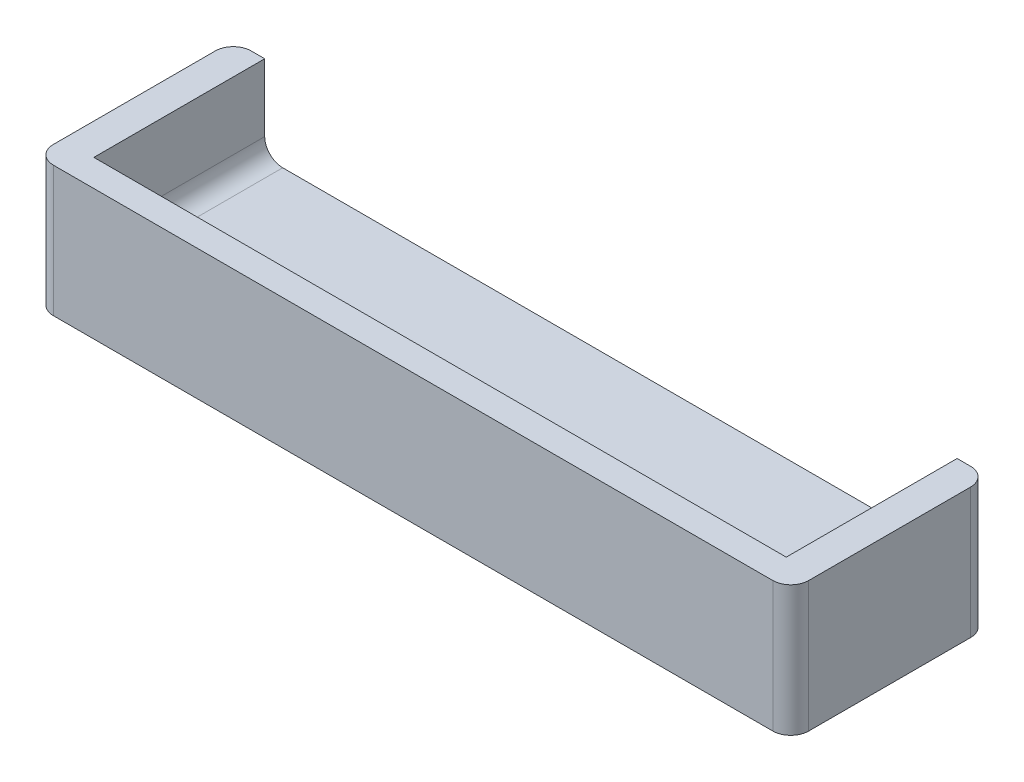
ISO-10303-21;
HEADER;
FILE_DESCRIPTION(('STEP AP214'),'2;1');
FILE_NAME('part.step','',(''),(''),'','','');
FILE_SCHEMA(('AUTOMOTIVE_DESIGN { 1 0 10303 214 1 1 1 1 }'));
ENDSEC;
DATA;
#1=APPLICATION_CONTEXT('core data for automotive mechanical design processes');
#2=APPLICATION_PROTOCOL_DEFINITION('international standard','automotive_design',2000,#1);
#3=PRODUCT_CONTEXT('',#1,'mechanical');
#4=PRODUCT('Part','Part','',(#3));
#5=PRODUCT_RELATED_PRODUCT_CATEGORY('part','',(#4));
#6=PRODUCT_DEFINITION_FORMATION('','',#4);
#7=PRODUCT_DEFINITION_CONTEXT('part definition',#1,'design');
#8=PRODUCT_DEFINITION('design','',#6,#7);
#9=PRODUCT_DEFINITION_SHAPE('','',#8);
#10=(LENGTH_UNIT() NAMED_UNIT(*) SI_UNIT(.MILLI.,.METRE.));
#11=(NAMED_UNIT(*) PLANE_ANGLE_UNIT() SI_UNIT($,.RADIAN.));
#12=(NAMED_UNIT(*) SI_UNIT($,.STERADIAN.) SOLID_ANGLE_UNIT());
#13=UNCERTAINTY_MEASURE_WITH_UNIT(LENGTH_MEASURE(1.E-05),#10,'distance_accuracy_value','');
#14=(GEOMETRIC_REPRESENTATION_CONTEXT(3) GLOBAL_UNCERTAINTY_ASSIGNED_CONTEXT((#13)) GLOBAL_UNIT_ASSIGNED_CONTEXT((#10,
#11,#12)) REPRESENTATION_CONTEXT('',''));
#15=CARTESIAN_POINT('',(0.,0.,0.));
#16=DIRECTION('',(0.,0.,1.));
#17=DIRECTION('',(1.,0.,0.));
#18=AXIS2_PLACEMENT_3D('',#15,#16,#17);
#19=CARTESIAN_POINT('',(42.,7.25000000000001,14.));
#20=DIRECTION('',(-1.,0.,0.));
#21=DIRECTION('',(0.,0.,1.));
#22=AXIS2_PLACEMENT_3D('',#19,#20,#21);
#23=PLANE('',#22);
#24=DIRECTION('',(0.,0.,-1.));
#25=VECTOR('',#24,1.);
#26=CARTESIAN_POINT('',(42.,7.25000000000001,14.));
#27=LINE('',#26,#25);
#28=CARTESIAN_POINT('',(42.,7.25000000000001,15.));
#29=VERTEX_POINT('',#28);
#30=CARTESIAN_POINT('',(42.,7.25000000000001,-3.));
#31=VERTEX_POINT('',#30);
#32=EDGE_CURVE('E195',#29,#31,#27,.T.);
#33=ORIENTED_EDGE('',*,*,#32,.F.);
#34=DIRECTION('',(0.,1.,0.));
#35=VECTOR('',#34,1.);
#36=CARTESIAN_POINT('',(42.,-7.25000000000001,15.));
#37=LINE('',#36,#35);
#38=CARTESIAN_POINT('',(42.,-7.25000000000001,15.));
#39=VERTEX_POINT('',#38);
#40=EDGE_CURVE('E235',#29,#39,#37,.F.);
#41=ORIENTED_EDGE('',*,*,#40,.T.);
#42=DIRECTION('',(0.,0.,-1.));
#43=VECTOR('',#42,1.);
#44=CARTESIAN_POINT('',(42.,-7.25000000000001,14.));
#45=LINE('',#44,#43);
#46=CARTESIAN_POINT('',(42.,-7.25000000000001,-3.));
#47=VERTEX_POINT('',#46);
#48=EDGE_CURVE('E186',#39,#47,#45,.T.);
#49=ORIENTED_EDGE('',*,*,#48,.T.);
#50=DIRECTION('',(0.,-1.,0.));
#51=VECTOR('',#50,1.);
#52=CARTESIAN_POINT('',(42.,7.25000000000001,-3.));
#53=LINE('',#52,#51);
#54=EDGE_CURVE('E56',#47,#31,#53,.F.);
#55=ORIENTED_EDGE('',*,*,#54,.T.);
#56=EDGE_LOOP('',(#33,#41,#49,#55));
#57=FACE_BOUND('',#56,.T.);
#58=ADVANCED_FACE('F33',(#57),#23,.F.);
#59=CARTESIAN_POINT('',(38.5,7.25000000000001,14.));
#60=DIRECTION('',(1.,0.,0.));
#61=DIRECTION('',(0.,0.,-1.));
#62=AXIS2_PLACEMENT_3D('',#59,#60,#61);
#63=PLANE('',#62);
#64=DIRECTION('',(0.,1.,0.));
#65=VECTOR('',#64,1.);
#66=CARTESIAN_POINT('',(38.5,-2.25000000000001,-5.));
#67=LINE('',#66,#65);
#68=CARTESIAN_POINT('',(38.5,-0.25000000000001,-5.));
#69=VERTEX_POINT('',#68);
#70=CARTESIAN_POINT('',(38.5,7.25000000000001,-5.));
#71=VERTEX_POINT('',#70);
#72=EDGE_CURVE('E166',#69,#71,#67,.T.);
#73=ORIENTED_EDGE('',*,*,#72,.F.);
#74=DIRECTION('',(0.,0.,-1.));
#75=VECTOR('',#74,1.);
#76=CARTESIAN_POINT('',(38.5,-0.25000000000001,14.));
#77=LINE('',#76,#75);
#78=CARTESIAN_POINT('',(38.5,-0.25000000000001,14.));
#79=VERTEX_POINT('',#78);
#80=EDGE_CURVE('E202',#69,#79,#77,.F.);
#81=ORIENTED_EDGE('',*,*,#80,.T.);
#82=DIRECTION('',(0.,-1.,0.));
#83=VECTOR('',#82,1.);
#84=CARTESIAN_POINT('',(38.5,7.25000000000001,14.));
#85=LINE('',#84,#83);
#86=CARTESIAN_POINT('',(38.5,7.25000000000001,14.));
#87=VERTEX_POINT('',#86);
#88=EDGE_CURVE('E177',#87,#79,#85,.T.);
#89=ORIENTED_EDGE('',*,*,#88,.F.);
#90=DIRECTION('',(0.,0.,-1.));
#91=VECTOR('',#90,1.);
#92=CARTESIAN_POINT('',(38.5,7.25000000000001,14.));
#93=LINE('',#92,#91);
#94=EDGE_CURVE('E156',#87,#71,#93,.T.);
#95=ORIENTED_EDGE('',*,*,#94,.T.);
#96=EDGE_LOOP('',(#73,#81,#89,#95));
#97=FACE_BOUND('',#96,.T.);
#98=ADVANCED_FACE('F246',(#97),#63,.F.);
#99=CARTESIAN_POINT('',(38.5,-2.25000000000001,14.));
#100=DIRECTION('',(0.,-1.,0.));
#101=DIRECTION('',(0.,0.,-1.));
#102=AXIS2_PLACEMENT_3D('',#99,#100,#101);
#103=PLANE('',#102);
#104=DIRECTION('',(-1.,0.,0.));
#105=VECTOR('',#104,1.);
#106=CARTESIAN_POINT('',(38.5,-2.25000000000001,14.));
#107=LINE('',#106,#105);
#108=CARTESIAN_POINT('',(36.5,-2.25000000000001,14.));
#109=VERTEX_POINT('',#108);
#110=CARTESIAN_POINT('',(-36.5,-2.25000000000001,14.));
#111=VERTEX_POINT('',#110);
#112=EDGE_CURVE('E181',#109,#111,#107,.T.);
#113=ORIENTED_EDGE('',*,*,#112,.F.);
#114=DIRECTION('',(0.,0.,-1.));
#115=VECTOR('',#114,1.);
#116=CARTESIAN_POINT('',(36.5,-2.25000000000001,-5.));
#117=LINE('',#116,#115);
#118=CARTESIAN_POINT('',(36.5,-2.25000000000001,-5.));
#119=VERTEX_POINT('',#118);
#120=EDGE_CURVE('E199',#109,#119,#117,.T.);
#121=ORIENTED_EDGE('',*,*,#120,.T.);
#122=DIRECTION('',(1.,0.,0.));
#123=VECTOR('',#122,1.);
#124=CARTESIAN_POINT('',(-38.5,-2.25000000000001,-5.));
#125=LINE('',#124,#123);
#126=CARTESIAN_POINT('',(-36.5,-2.25000000000001,-5.));
#127=VERTEX_POINT('',#126);
#128=EDGE_CURVE('E163',#127,#119,#125,.T.);
#129=ORIENTED_EDGE('',*,*,#128,.F.);
#130=DIRECTION('',(0.,0.,-1.));
#131=VECTOR('',#130,1.);
#132=CARTESIAN_POINT('',(-36.5,-2.25000000000001,14.));
#133=LINE('',#132,#131);
#134=EDGE_CURVE('E197',#127,#111,#133,.F.);
#135=ORIENTED_EDGE('',*,*,#134,.T.);
#136=EDGE_LOOP('',(#113,#121,#129,#135));
#137=FACE_BOUND('',#136,.T.);
#138=ADVANCED_FACE('F255',(#137),#103,.F.);
#139=CARTESIAN_POINT('',(-38.5,7.25000000000001,14.));
#140=DIRECTION('',(-1.,0.,0.));
#141=DIRECTION('',(0.,0.,1.));
#142=AXIS2_PLACEMENT_3D('',#139,#140,#141);
#143=PLANE('',#142);
#144=DIRECTION('',(0.,1.,0.));
#145=VECTOR('',#144,1.);
#146=CARTESIAN_POINT('',(-38.5,7.25000000000001,14.));
#147=LINE('',#146,#145);
#148=CARTESIAN_POINT('',(-38.5,-0.25000000000001,14.));
#149=VERTEX_POINT('',#148);
#150=CARTESIAN_POINT('',(-38.5,7.25000000000001,14.));
#151=VERTEX_POINT('',#150);
#152=EDGE_CURVE('E184',#149,#151,#147,.T.);
#153=ORIENTED_EDGE('',*,*,#152,.F.);
#154=DIRECTION('',(0.,0.,-1.));
#155=VECTOR('',#154,1.);
#156=CARTESIAN_POINT('',(-38.5,-0.25000000000001,-5.));
#157=LINE('',#156,#155);
#158=CARTESIAN_POINT('',(-38.5,-0.25000000000001,-5.));
#159=VERTEX_POINT('',#158);
#160=EDGE_CURVE('E162',#149,#159,#157,.T.);
#161=ORIENTED_EDGE('',*,*,#160,.T.);
#162=DIRECTION('',(0.,-1.,0.));
#163=VECTOR('',#162,1.);
#164=CARTESIAN_POINT('',(-38.5,7.25000000000001,-5.));
#165=LINE('',#164,#163);
#166=CARTESIAN_POINT('',(-38.5,7.25000000000001,-5.));
#167=VERTEX_POINT('',#166);
#168=EDGE_CURVE('E142',#167,#159,#165,.T.);
#169=ORIENTED_EDGE('',*,*,#168,.F.);
#170=DIRECTION('',(0.,0.,-1.));
#171=VECTOR('',#170,1.);
#172=CARTESIAN_POINT('',(-38.5,7.25000000000001,14.));
#173=LINE('',#172,#171);
#174=EDGE_CURVE('E149',#151,#167,#173,.T.);
#175=ORIENTED_EDGE('',*,*,#174,.F.);
#176=EDGE_LOOP('',(#153,#161,#169,#175));
#177=FACE_BOUND('',#176,.T.);
#178=ADVANCED_FACE('F160',(#177),#143,.F.);
#179=CARTESIAN_POINT('',(-38.5,7.25000000000001,14.));
#180=DIRECTION('',(0.,-1.,0.));
#181=DIRECTION('',(0.,0.,-1.));
#182=AXIS2_PLACEMENT_3D('',#179,#180,#181);
#183=PLANE('',#182);
#184=DIRECTION('',(0.,0.,-1.));
#185=VECTOR('',#184,1.);
#186=CARTESIAN_POINT('',(-42.,7.25000000000001,14.));
#187=LINE('',#186,#185);
#188=CARTESIAN_POINT('',(-42.,7.25000000000001,15.));
#189=VERTEX_POINT('',#188);
#190=CARTESIAN_POINT('',(-42.,7.25000000000001,-3.));
#191=VERTEX_POINT('',#190);
#192=EDGE_CURVE('E157',#189,#191,#187,.T.);
#193=ORIENTED_EDGE('',*,*,#192,.F.);
#194=CARTESIAN_POINT('',(-40.,7.25000000000001,15.));
#195=DIRECTION('',(0.,-1.,0.));
#196=DIRECTION('',(0.,0.,-1.));
#197=AXIS2_PLACEMENT_3D('',#194,#195,#196);
#198=CIRCLE('',#197,2.);
#199=CARTESIAN_POINT('',(-40.,7.25000000000001,17.));
#200=VERTEX_POINT('',#199);
#201=EDGE_CURVE('E232',#189,#200,#198,.F.);
#202=ORIENTED_EDGE('',*,*,#201,.T.);
#203=DIRECTION('',(-1.,0.,0.));
#204=VECTOR('',#203,1.);
#205=CARTESIAN_POINT('',(-42.,7.25000000000001,17.));
#206=LINE('',#205,#204);
#207=CARTESIAN_POINT('',(40.,7.25000000000001,17.));
#208=VERTEX_POINT('',#207);
#209=EDGE_CURVE('E174',#208,#200,#206,.T.);
#210=ORIENTED_EDGE('',*,*,#209,.F.);
#211=CARTESIAN_POINT('',(40.,7.25000000000001,15.));
#212=DIRECTION('',(0.,-1.,0.));
#213=DIRECTION('',(0.,0.,-1.));
#214=AXIS2_PLACEMENT_3D('',#211,#212,#213);
#215=CIRCLE('',#214,2.);
#216=EDGE_CURVE('E230',#208,#29,#215,.F.);
#217=ORIENTED_EDGE('',*,*,#216,.T.);
#218=ORIENTED_EDGE('',*,*,#32,.T.);
#219=CARTESIAN_POINT('',(40.,7.25000000000001,-3.));
#220=DIRECTION('',(0.,-1.,0.));
#221=DIRECTION('',(0.,0.,-1.));
#222=AXIS2_PLACEMENT_3D('',#219,#220,#221);
#223=CIRCLE('',#222,2.);
#224=CARTESIAN_POINT('',(40.,7.25000000000001,-5.));
#225=VERTEX_POINT('',#224);
#226=EDGE_CURVE('E48',#31,#225,#223,.F.);
#227=ORIENTED_EDGE('',*,*,#226,.T.);
#228=DIRECTION('',(1.,0.,0.));
#229=VECTOR('',#228,1.);
#230=CARTESIAN_POINT('',(38.5,7.25000000000001,-5.));
#231=LINE('',#230,#229);
#232=EDGE_CURVE('E348',#71,#225,#231,.T.);
#233=ORIENTED_EDGE('',*,*,#232,.F.);
#234=ORIENTED_EDGE('',*,*,#94,.F.);
#235=DIRECTION('',(-1.,0.,0.));
#236=VECTOR('',#235,1.);
#237=CARTESIAN_POINT('',(-42.,7.25000000000001,14.));
#238=LINE('',#237,#236);
#239=EDGE_CURVE('E153',#87,#151,#238,.T.);
#240=ORIENTED_EDGE('',*,*,#239,.T.);
#241=ORIENTED_EDGE('',*,*,#174,.T.);
#242=DIRECTION('',(1.,0.,0.));
#243=VECTOR('',#242,1.);
#244=CARTESIAN_POINT('',(-42.,7.25000000000001,-5.));
#245=LINE('',#244,#243);
#246=CARTESIAN_POINT('',(-40.,7.25000000000001,-5.));
#247=VERTEX_POINT('',#246);
#248=EDGE_CURVE('E137',#247,#167,#245,.T.);
#249=ORIENTED_EDGE('',*,*,#248,.F.);
#250=CARTESIAN_POINT('',(-40.,7.25000000000001,-3.));
#251=DIRECTION('',(0.,-1.,0.));
#252=DIRECTION('',(0.,0.,-1.));
#253=AXIS2_PLACEMENT_3D('',#250,#251,#252);
#254=CIRCLE('',#253,2.);
#255=EDGE_CURVE('E228',#247,#191,#254,.F.);
#256=ORIENTED_EDGE('',*,*,#255,.T.);
#257=EDGE_LOOP('',(#193,#202,#210,#217,#218,#227,#233,#234,#240,#241,#249,#256));
#258=FACE_BOUND('',#257,.T.);
#259=ADVANCED_FACE('F151',(#258),#183,.F.);
#260=CARTESIAN_POINT('',(-42.,7.25000000000001,14.));
#261=DIRECTION('',(1.,0.,0.));
#262=DIRECTION('',(0.,0.,-1.));
#263=AXIS2_PLACEMENT_3D('',#260,#261,#262);
#264=PLANE('',#263);
#265=DIRECTION('',(0.,0.,-1.));
#266=VECTOR('',#265,1.);
#267=CARTESIAN_POINT('',(-42.,-7.25000000000001,14.));
#268=LINE('',#267,#266);
#269=CARTESIAN_POINT('',(-42.,-7.25000000000001,15.));
#270=VERTEX_POINT('',#269);
#271=CARTESIAN_POINT('',(-42.,-7.25000000000001,-3.));
#272=VERTEX_POINT('',#271);
#273=EDGE_CURVE('E188',#270,#272,#268,.T.);
#274=ORIENTED_EDGE('',*,*,#273,.F.);
#275=DIRECTION('',(0.,-1.,0.));
#276=VECTOR('',#275,1.);
#277=CARTESIAN_POINT('',(-42.,7.25000000000001,15.));
#278=LINE('',#277,#276);
#279=EDGE_CURVE('E225',#270,#189,#278,.F.);
#280=ORIENTED_EDGE('',*,*,#279,.T.);
#281=ORIENTED_EDGE('',*,*,#192,.T.);
#282=DIRECTION('',(0.,1.,0.));
#283=VECTOR('',#282,1.);
#284=CARTESIAN_POINT('',(-42.,-7.25000000000001,-3.));
#285=LINE('',#284,#283);
#286=EDGE_CURVE('E223',#191,#272,#285,.F.);
#287=ORIENTED_EDGE('',*,*,#286,.T.);
#288=EDGE_LOOP('',(#274,#280,#281,#287));
#289=FACE_BOUND('',#288,.T.);
#290=ADVANCED_FACE('F283',(#289),#264,.F.);
#291=CARTESIAN_POINT('',(42.,-7.25000000000001,14.));
#292=DIRECTION('',(0.,1.,0.));
#293=DIRECTION('',(0.,0.,1.));
#294=AXIS2_PLACEMENT_3D('',#291,#292,#293);
#295=PLANE('',#294);
#296=DIRECTION('',(1.,0.,0.));
#297=VECTOR('',#296,1.);
#298=CARTESIAN_POINT('',(-42.,-7.25000000000001,17.));
#299=LINE('',#298,#297);
#300=CARTESIAN_POINT('',(-40.,-7.25000000000001,17.));
#301=VERTEX_POINT('',#300);
#302=CARTESIAN_POINT('',(40.,-7.25000000000001,17.));
#303=VERTEX_POINT('',#302);
#304=EDGE_CURVE('E171',#301,#303,#299,.T.);
#305=ORIENTED_EDGE('',*,*,#304,.F.);
#306=CARTESIAN_POINT('',(-40.,-7.25000000000001,15.));
#307=DIRECTION('',(0.,1.,0.));
#308=DIRECTION('',(0.,0.,1.));
#309=AXIS2_PLACEMENT_3D('',#306,#307,#308);
#310=CIRCLE('',#309,2.);
#311=EDGE_CURVE('E221',#301,#270,#310,.F.);
#312=ORIENTED_EDGE('',*,*,#311,.T.);
#313=ORIENTED_EDGE('',*,*,#273,.T.);
#314=CARTESIAN_POINT('',(-40.,-7.25000000000001,-3.));
#315=DIRECTION('',(0.,1.,0.));
#316=DIRECTION('',(0.,0.,1.));
#317=AXIS2_PLACEMENT_3D('',#314,#315,#316);
#318=CIRCLE('',#317,2.);
#319=CARTESIAN_POINT('',(-40.,-7.25000000000001,-5.));
#320=VERTEX_POINT('',#319);
#321=EDGE_CURVE('E217',#272,#320,#318,.F.);
#322=ORIENTED_EDGE('',*,*,#321,.T.);
#323=DIRECTION('',(-1.,0.,0.));
#324=VECTOR('',#323,1.);
#325=CARTESIAN_POINT('',(42.,-7.25000000000001,-5.));
#326=LINE('',#325,#324);
#327=CARTESIAN_POINT('',(40.,-7.25000000000001,-5.));
#328=VERTEX_POINT('',#327);
#329=EDGE_CURVE('E145',#328,#320,#326,.T.);
#330=ORIENTED_EDGE('',*,*,#329,.F.);
#331=CARTESIAN_POINT('',(40.,-7.25000000000001,-3.));
#332=DIRECTION('',(0.,1.,0.));
#333=DIRECTION('',(0.,0.,1.));
#334=AXIS2_PLACEMENT_3D('',#331,#332,#333);
#335=CIRCLE('',#334,2.);
#336=EDGE_CURVE('E215',#328,#47,#335,.F.);
#337=ORIENTED_EDGE('',*,*,#336,.T.);
#338=ORIENTED_EDGE('',*,*,#48,.F.);
#339=CARTESIAN_POINT('',(40.,-7.25000000000001,15.));
#340=DIRECTION('',(0.,1.,0.));
#341=DIRECTION('',(0.,0.,1.));
#342=AXIS2_PLACEMENT_3D('',#339,#340,#341);
#343=CIRCLE('',#342,2.);
#344=EDGE_CURVE('E219',#39,#303,#343,.F.);
#345=ORIENTED_EDGE('',*,*,#344,.T.);
#346=EDGE_LOOP('',(#305,#312,#313,#322,#330,#337,#338,#345));
#347=FACE_BOUND('',#346,.T.);
#348=ADVANCED_FACE('F286',(#347),#295,.F.);
#349=CARTESIAN_POINT('',(0.,0.,14.));
#350=DIRECTION('',(0.,0.,1.));
#351=DIRECTION('',(1.,0.,0.));
#352=AXIS2_PLACEMENT_3D('',#349,#350,#351);
#353=PLANE('',#352);
#354=ORIENTED_EDGE('',*,*,#88,.T.);
#355=CARTESIAN_POINT('',(36.5,-0.25000000000001,14.));
#356=DIRECTION('',(0.,0.,1.));
#357=DIRECTION('',(1.,0.,0.));
#358=AXIS2_PLACEMENT_3D('',#355,#356,#357);
#359=CIRCLE('',#358,2.);
#360=EDGE_CURVE('E206',#79,#109,#359,.F.);
#361=ORIENTED_EDGE('',*,*,#360,.T.);
#362=ORIENTED_EDGE('',*,*,#112,.T.);
#363=CARTESIAN_POINT('',(-36.5,-0.25000000000001,14.));
#364=DIRECTION('',(0.,0.,1.));
#365=DIRECTION('',(1.,0.,0.));
#366=AXIS2_PLACEMENT_3D('',#363,#364,#365);
#367=CIRCLE('',#366,2.);
#368=EDGE_CURVE('E204',#111,#149,#367,.F.);
#369=ORIENTED_EDGE('',*,*,#368,.T.);
#370=ORIENTED_EDGE('',*,*,#152,.T.);
#371=ORIENTED_EDGE('',*,*,#239,.F.);
#372=EDGE_LOOP('',(#354,#361,#362,#369,#370,#371));
#373=FACE_BOUND('',#372,.T.);
#374=ADVANCED_FACE('F252',(#373),#353,.F.);
#375=CARTESIAN_POINT('',(0.,0.,17.));
#376=DIRECTION('',(0.,0.,1.));
#377=DIRECTION('',(1.,0.,0.));
#378=AXIS2_PLACEMENT_3D('',#375,#376,#377);
#379=PLANE('',#378);
#380=ORIENTED_EDGE('',*,*,#209,.T.);
#381=DIRECTION('',(0.,-1.,0.));
#382=VECTOR('',#381,1.);
#383=CARTESIAN_POINT('',(-40.,-7.25000000000001,17.));
#384=LINE('',#383,#382);
#385=EDGE_CURVE('E212',#200,#301,#384,.T.);
#386=ORIENTED_EDGE('',*,*,#385,.T.);
#387=ORIENTED_EDGE('',*,*,#304,.T.);
#388=DIRECTION('',(0.,1.,0.));
#389=VECTOR('',#388,1.);
#390=CARTESIAN_POINT('',(40.,7.25000000000001,17.));
#391=LINE('',#390,#389);
#392=EDGE_CURVE('E209',#303,#208,#391,.T.);
#393=ORIENTED_EDGE('',*,*,#392,.T.);
#394=EDGE_LOOP('',(#380,#386,#387,#393));
#395=FACE_BOUND('',#394,.T.);
#396=ADVANCED_FACE('F293',(#395),#379,.T.);
#397=CARTESIAN_POINT('',(0.,0.,-5.));
#398=DIRECTION('',(0.,0.,-1.));
#399=DIRECTION('',(-1.,0.,0.));
#400=AXIS2_PLACEMENT_3D('',#397,#398,#399);
#401=PLANE('',#400);
#402=ORIENTED_EDGE('',*,*,#329,.T.);
#403=DIRECTION('',(0.,1.,0.));
#404=VECTOR('',#403,1.);
#405=CARTESIAN_POINT('',(-40.,7.25000000000001,-5.));
#406=LINE('',#405,#404);
#407=EDGE_CURVE('E144',#320,#247,#406,.T.);
#408=ORIENTED_EDGE('',*,*,#407,.T.);
#409=ORIENTED_EDGE('',*,*,#248,.T.);
#410=ORIENTED_EDGE('',*,*,#168,.T.);
#411=CARTESIAN_POINT('',(-36.5,-0.25000000000001,-5.));
#412=DIRECTION('',(0.,0.,-1.));
#413=DIRECTION('',(-1.,0.,0.));
#414=AXIS2_PLACEMENT_3D('',#411,#412,#413);
#415=CIRCLE('',#414,2.);
#416=EDGE_CURVE('E11',#159,#127,#415,.F.);
#417=ORIENTED_EDGE('',*,*,#416,.T.);
#418=ORIENTED_EDGE('',*,*,#128,.T.);
#419=CARTESIAN_POINT('',(36.5,-0.25000000000001,-5.));
#420=DIRECTION('',(0.,0.,-1.));
#421=DIRECTION('',(-1.,0.,0.));
#422=AXIS2_PLACEMENT_3D('',#419,#420,#421);
#423=CIRCLE('',#422,2.);
#424=EDGE_CURVE('E41',#119,#69,#423,.F.);
#425=ORIENTED_EDGE('',*,*,#424,.T.);
#426=ORIENTED_EDGE('',*,*,#72,.T.);
#427=ORIENTED_EDGE('',*,*,#232,.T.);
#428=DIRECTION('',(0.,-1.,0.));
#429=VECTOR('',#428,1.);
#430=CARTESIAN_POINT('',(40.,-7.25000000000001,-5.));
#431=LINE('',#430,#429);
#432=EDGE_CURVE('E237',#225,#328,#431,.T.);
#433=ORIENTED_EDGE('',*,*,#432,.T.);
#434=EDGE_LOOP('',(#402,#408,#409,#410,#417,#418,#425,#426,#427,#433));
#435=FACE_BOUND('',#434,.T.);
#436=ADVANCED_FACE('F140',(#435),#401,.T.);
#437=CARTESIAN_POINT('',(36.5,-0.25000000000001,14.));
#438=DIRECTION('',(0.,0.,1.));
#439=DIRECTION('',(1.,0.,0.));
#440=AXIS2_PLACEMENT_3D('',#437,#438,#439);
#441=CYLINDRICAL_SURFACE('',#440,2.);
#442=ORIENTED_EDGE('',*,*,#360,.F.);
#443=ORIENTED_EDGE('',*,*,#80,.F.);
#444=ORIENTED_EDGE('',*,*,#424,.F.);
#445=ORIENTED_EDGE('',*,*,#120,.F.);
#446=EDGE_LOOP('',(#442,#443,#444,#445));
#447=FACE_BOUND('',#446,.T.);
#448=ADVANCED_FACE('F249',(#447),#441,.F.);
#449=CARTESIAN_POINT('',(-36.5,-0.25000000000001,14.));
#450=DIRECTION('',(0.,0.,1.));
#451=DIRECTION('',(1.,0.,0.));
#452=AXIS2_PLACEMENT_3D('',#449,#450,#451);
#453=CYLINDRICAL_SURFACE('',#452,2.);
#454=ORIENTED_EDGE('',*,*,#368,.F.);
#455=ORIENTED_EDGE('',*,*,#134,.F.);
#456=ORIENTED_EDGE('',*,*,#416,.F.);
#457=ORIENTED_EDGE('',*,*,#160,.F.);
#458=EDGE_LOOP('',(#454,#455,#456,#457));
#459=FACE_BOUND('',#458,.T.);
#460=ADVANCED_FACE('F258',(#459),#453,.F.);
#461=CARTESIAN_POINT('',(-40.,0.,15.));
#462=DIRECTION('',(0.,1.,0.));
#463=DIRECTION('',(0.,0.,1.));
#464=AXIS2_PLACEMENT_3D('',#461,#462,#463);
#465=CYLINDRICAL_SURFACE('',#464,2.);
#466=ORIENTED_EDGE('',*,*,#201,.F.);
#467=ORIENTED_EDGE('',*,*,#279,.F.);
#468=ORIENTED_EDGE('',*,*,#311,.F.);
#469=ORIENTED_EDGE('',*,*,#385,.F.);
#470=EDGE_LOOP('',(#466,#467,#468,#469));
#471=FACE_BOUND('',#470,.T.);
#472=ADVANCED_FACE('F260',(#471),#465,.T.);
#473=CARTESIAN_POINT('',(40.,0.,15.));
#474=DIRECTION('',(0.,-1.,0.));
#475=DIRECTION('',(0.,0.,-1.));
#476=AXIS2_PLACEMENT_3D('',#473,#474,#475);
#477=CYLINDRICAL_SURFACE('',#476,2.);
#478=ORIENTED_EDGE('',*,*,#344,.F.);
#479=ORIENTED_EDGE('',*,*,#40,.F.);
#480=ORIENTED_EDGE('',*,*,#216,.F.);
#481=ORIENTED_EDGE('',*,*,#392,.F.);
#482=EDGE_LOOP('',(#478,#479,#480,#481));
#483=FACE_BOUND('',#482,.T.);
#484=ADVANCED_FACE('F266',(#483),#477,.T.);
#485=CARTESIAN_POINT('',(-40.,0.,-3.));
#486=DIRECTION('',(0.,-1.,0.));
#487=DIRECTION('',(0.,0.,-1.));
#488=AXIS2_PLACEMENT_3D('',#485,#486,#487);
#489=CYLINDRICAL_SURFACE('',#488,2.);
#490=ORIENTED_EDGE('',*,*,#321,.F.);
#491=ORIENTED_EDGE('',*,*,#286,.F.);
#492=ORIENTED_EDGE('',*,*,#255,.F.);
#493=ORIENTED_EDGE('',*,*,#407,.F.);
#494=EDGE_LOOP('',(#490,#491,#492,#493));
#495=FACE_BOUND('',#494,.T.);
#496=ADVANCED_FACE('F325',(#495),#489,.T.);
#497=CARTESIAN_POINT('',(40.,0.,-3.));
#498=DIRECTION('',(0.,1.,0.));
#499=DIRECTION('',(0.,0.,1.));
#500=AXIS2_PLACEMENT_3D('',#497,#498,#499);
#501=CYLINDRICAL_SURFACE('',#500,2.);
#502=ORIENTED_EDGE('',*,*,#226,.F.);
#503=ORIENTED_EDGE('',*,*,#54,.F.);
#504=ORIENTED_EDGE('',*,*,#336,.F.);
#505=ORIENTED_EDGE('',*,*,#432,.F.);
#506=EDGE_LOOP('',(#502,#503,#504,#505));
#507=FACE_BOUND('',#506,.T.);
#508=ADVANCED_FACE('F35',(#507),#501,.T.);
#509=CLOSED_SHELL('',(#58,#98,#138,#178,#259,#290,#348,#374,#396,#436,#448,#460,#472,#484,#496,#508));
#510=MANIFOLD_SOLID_BREP('B2',#509);
#511=ADVANCED_BREP_SHAPE_REPRESENTATION('',(#18,#510),#14);
#512=SHAPE_DEFINITION_REPRESENTATION(#9,#511);
ENDSEC;
END-ISO-10303-21;
